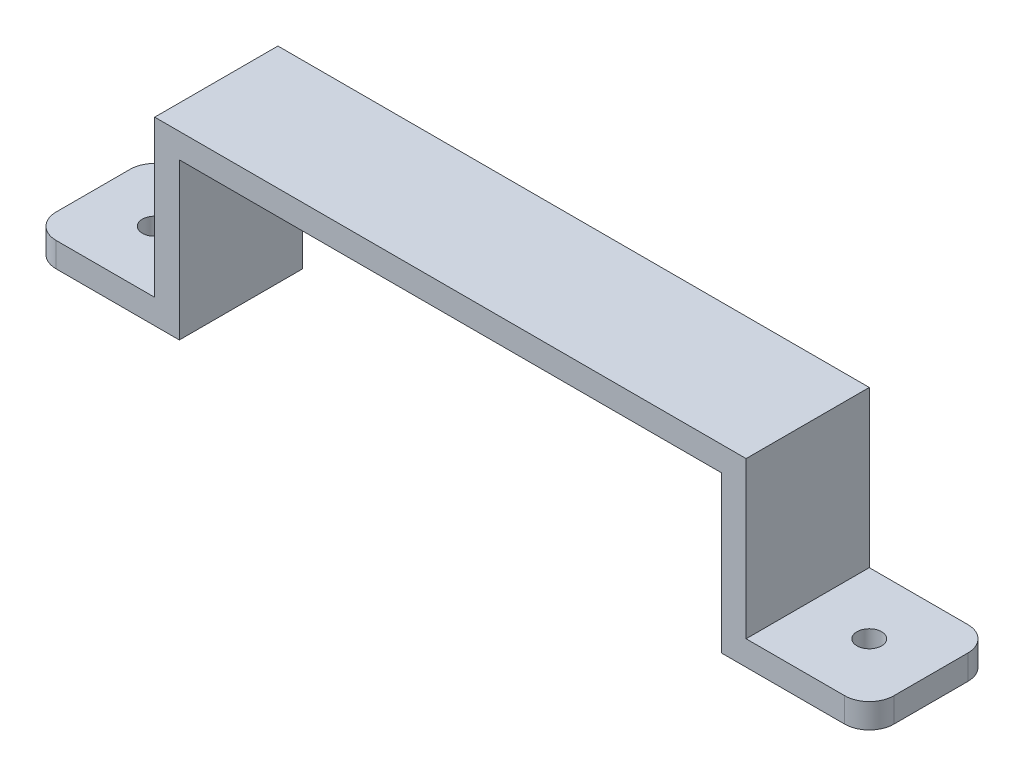
ISO-10303-21;
HEADER;
FILE_DESCRIPTION(('STEP AP214'),'2;1');
FILE_NAME('part.step','',(''),(''),'','','');
FILE_SCHEMA(('AUTOMOTIVE_DESIGN { 1 0 10303 214 1 1 1 1 }'));
ENDSEC;
DATA;
#1=APPLICATION_CONTEXT('core data for automotive mechanical design processes');
#2=APPLICATION_PROTOCOL_DEFINITION('international standard','automotive_design',2000,#1);
#3=PRODUCT_CONTEXT('',#1,'mechanical');
#4=PRODUCT('Part','Part','',(#3));
#5=PRODUCT_RELATED_PRODUCT_CATEGORY('part','',(#4));
#6=PRODUCT_DEFINITION_FORMATION('','',#4);
#7=PRODUCT_DEFINITION_CONTEXT('part definition',#1,'design');
#8=PRODUCT_DEFINITION('design','',#6,#7);
#9=PRODUCT_DEFINITION_SHAPE('','',#8);
#10=(LENGTH_UNIT() NAMED_UNIT(*) SI_UNIT(.MILLI.,.METRE.));
#11=(NAMED_UNIT(*) PLANE_ANGLE_UNIT() SI_UNIT($,.RADIAN.));
#12=(NAMED_UNIT(*) SI_UNIT($,.STERADIAN.) SOLID_ANGLE_UNIT());
#13=UNCERTAINTY_MEASURE_WITH_UNIT(LENGTH_MEASURE(1.E-05),#10,'distance_accuracy_value','');
#14=(GEOMETRIC_REPRESENTATION_CONTEXT(3) GLOBAL_UNCERTAINTY_ASSIGNED_CONTEXT((#13)) GLOBAL_UNIT_ASSIGNED_CONTEXT((#10,
#11,#12)) REPRESENTATION_CONTEXT('',''));
#15=CARTESIAN_POINT('',(0.,0.,0.));
#16=DIRECTION('',(0.,0.,1.));
#17=DIRECTION('',(1.,0.,0.));
#18=AXIS2_PLACEMENT_3D('',#15,#16,#17);
#19=CARTESIAN_POINT('',(-36.,-19.,15.));
#20=DIRECTION('',(1.,0.,0.));
#21=DIRECTION('',(0.,0.,-1.));
#22=AXIS2_PLACEMENT_3D('',#19,#20,#21);
#23=PLANE('',#22);
#24=DIRECTION('',(0.,-1.,0.));
#25=VECTOR('',#24,1.);
#26=CARTESIAN_POINT('',(-36.,-19.,0.));
#27=LINE('',#26,#25);
#28=CARTESIAN_POINT('',(-36.,0.,0.));
#29=VERTEX_POINT('',#28);
#30=CARTESIAN_POINT('',(-36.,-19.,0.));
#31=VERTEX_POINT('',#30);
#32=EDGE_CURVE('E184',#29,#31,#27,.T.);
#33=ORIENTED_EDGE('',*,*,#32,.T.);
#34=DIRECTION('',(0.,0.,-1.));
#35=VECTOR('',#34,1.);
#36=CARTESIAN_POINT('',(-36.,-19.,15.));
#37=LINE('',#36,#35);
#38=CARTESIAN_POINT('',(-36.,-19.,15.));
#39=VERTEX_POINT('',#38);
#40=EDGE_CURVE('E162',#39,#31,#37,.T.);
#41=ORIENTED_EDGE('',*,*,#40,.F.);
#42=DIRECTION('',(0.,-1.,0.));
#43=VECTOR('',#42,1.);
#44=CARTESIAN_POINT('',(-36.,-19.,15.));
#45=LINE('',#44,#43);
#46=CARTESIAN_POINT('',(-36.,0.,15.));
#47=VERTEX_POINT('',#46);
#48=EDGE_CURVE('E171',#47,#39,#45,.T.);
#49=ORIENTED_EDGE('',*,*,#48,.F.);
#50=DIRECTION('',(0.,0.,-1.));
#51=VECTOR('',#50,1.);
#52=CARTESIAN_POINT('',(-36.,0.,15.));
#53=LINE('',#52,#51);
#54=EDGE_CURVE('E317',#47,#29,#53,.T.);
#55=ORIENTED_EDGE('',*,*,#54,.T.);
#56=EDGE_LOOP('',(#33,#41,#49,#55));
#57=FACE_BOUND('',#56,.T.);
#58=ADVANCED_FACE('F42',(#57),#23,.F.);
#59=CARTESIAN_POINT('',(-51.,-19.,15.));
#60=DIRECTION('',(0.,-1.,0.));
#61=DIRECTION('',(1.,0.,0.));
#62=AXIS2_PLACEMENT_3D('',#59,#60,#61);
#63=PLANE('',#62);
#64=CARTESIAN_POINT('',(-43.5,-19.,7.5));
#65=DIRECTION('',(0.,1.,0.));
#66=DIRECTION('',(0.,0.,1.));
#67=AXIS2_PLACEMENT_3D('',#64,#65,#66);
#68=CIRCLE('',#67,1.5);
#69=CARTESIAN_POINT('',(-43.5,-19.,9.00000000000001));
#70=VERTEX_POINT('',#69);
#71=EDGE_CURVE('E427',#70,#70,#68,.T.);
#72=ORIENTED_EDGE('',*,*,#71,.F.);
#73=EDGE_LOOP('',(#72));
#74=FACE_BOUND('',#73,.T.);
#75=DIRECTION('',(0.,0.,-1.));
#76=VECTOR('',#75,1.);
#77=CARTESIAN_POINT('',(-51.,-19.,15.));
#78=LINE('',#77,#76);
#79=CARTESIAN_POINT('',(-51.,-19.,12.));
#80=VERTEX_POINT('',#79);
#81=CARTESIAN_POINT('',(-51.,-19.,3.));
#82=VERTEX_POINT('',#81);
#83=EDGE_CURVE('E187',#80,#82,#78,.T.);
#84=ORIENTED_EDGE('',*,*,#83,.F.);
#85=CARTESIAN_POINT('',(-48.,-19.,12.));
#86=DIRECTION('',(0.,-1.,0.));
#87=DIRECTION('',(1.,0.,0.));
#88=AXIS2_PLACEMENT_3D('',#85,#86,#87);
#89=CIRCLE('',#88,3.);
#90=CARTESIAN_POINT('',(-48.,-19.,15.));
#91=VERTEX_POINT('',#90);
#92=EDGE_CURVE('E165',#80,#91,#89,.F.);
#93=ORIENTED_EDGE('',*,*,#92,.T.);
#94=DIRECTION('',(-1.,0.,0.));
#95=VECTOR('',#94,1.);
#96=CARTESIAN_POINT('',(-51.,-19.,15.));
#97=LINE('',#96,#95);
#98=EDGE_CURVE('E156',#39,#91,#97,.T.);
#99=ORIENTED_EDGE('',*,*,#98,.F.);
#100=ORIENTED_EDGE('',*,*,#40,.T.);
#101=DIRECTION('',(-1.,0.,0.));
#102=VECTOR('',#101,1.);
#103=CARTESIAN_POINT('',(-51.,-19.,0.));
#104=LINE('',#103,#102);
#105=CARTESIAN_POINT('',(-48.,-19.,0.));
#106=VERTEX_POINT('',#105);
#107=EDGE_CURVE('E320',#31,#106,#104,.T.);
#108=ORIENTED_EDGE('',*,*,#107,.T.);
#109=CARTESIAN_POINT('',(-48.,-19.,3.));
#110=DIRECTION('',(0.,-1.,0.));
#111=DIRECTION('',(1.,0.,0.));
#112=AXIS2_PLACEMENT_3D('',#109,#110,#111);
#113=CIRCLE('',#112,3.);
#114=EDGE_CURVE('E219',#106,#82,#113,.F.);
#115=ORIENTED_EDGE('',*,*,#114,.T.);
#116=EDGE_LOOP('',(#84,#93,#99,#100,#108,#115));
#117=FACE_BOUND('',#116,.T.);
#118=ADVANCED_FACE('F159',(#74,#117),#63,.F.);
#119=CARTESIAN_POINT('',(-51.,-22.,15.));
#120=DIRECTION('',(1.,0.,0.));
#121=DIRECTION('',(0.,0.,-1.));
#122=AXIS2_PLACEMENT_3D('',#119,#120,#121);
#123=PLANE('',#122);
#124=DIRECTION('',(0.,0.,-1.));
#125=VECTOR('',#124,1.);
#126=CARTESIAN_POINT('',(-51.,-22.,15.));
#127=LINE('',#126,#125);
#128=CARTESIAN_POINT('',(-51.,-22.,12.));
#129=VERTEX_POINT('',#128);
#130=CARTESIAN_POINT('',(-51.,-22.,3.));
#131=VERTEX_POINT('',#130);
#132=EDGE_CURVE('E195',#129,#131,#127,.T.);
#133=ORIENTED_EDGE('',*,*,#132,.F.);
#134=DIRECTION('',(0.,-1.,0.));
#135=VECTOR('',#134,1.);
#136=CARTESIAN_POINT('',(-51.,-22.,12.));
#137=LINE('',#136,#135);
#138=EDGE_CURVE('E216',#129,#80,#137,.F.);
#139=ORIENTED_EDGE('',*,*,#138,.T.);
#140=ORIENTED_EDGE('',*,*,#83,.T.);
#141=DIRECTION('',(0.,-1.,0.));
#142=VECTOR('',#141,1.);
#143=CARTESIAN_POINT('',(-51.,-22.,3.));
#144=LINE('',#143,#142);
#145=EDGE_CURVE('E212',#82,#131,#144,.T.);
#146=ORIENTED_EDGE('',*,*,#145,.T.);
#147=EDGE_LOOP('',(#133,#139,#140,#146));
#148=FACE_BOUND('',#147,.T.);
#149=ADVANCED_FACE('F287',(#148),#123,.F.);
#150=CARTESIAN_POINT('',(-33.,-22.,15.));
#151=DIRECTION('',(0.,1.,0.));
#152=DIRECTION('',(-1.,0.,0.));
#153=AXIS2_PLACEMENT_3D('',#150,#151,#152);
#154=PLANE('',#153);
#155=CARTESIAN_POINT('',(-43.5,-22.,7.5));
#156=DIRECTION('',(0.,1.,0.));
#157=DIRECTION('',(-1.,0.,0.));
#158=AXIS2_PLACEMENT_3D('',#155,#156,#157);
#159=CIRCLE('',#158,1.5);
#160=CARTESIAN_POINT('',(-45.,-22.,7.5));
#161=VERTEX_POINT('',#160);
#162=EDGE_CURVE('E199',#161,#161,#159,.T.);
#163=ORIENTED_EDGE('',*,*,#162,.T.);
#164=EDGE_LOOP('',(#163));
#165=FACE_BOUND('',#164,.T.);
#166=DIRECTION('',(1.,0.,0.));
#167=VECTOR('',#166,1.);
#168=CARTESIAN_POINT('',(-33.,-22.,15.));
#169=LINE('',#168,#167);
#170=CARTESIAN_POINT('',(-48.,-22.,15.));
#171=VERTEX_POINT('',#170);
#172=CARTESIAN_POINT('',(-33.,-22.,15.));
#173=VERTEX_POINT('',#172);
#174=EDGE_CURVE('E170',#171,#173,#169,.T.);
#175=ORIENTED_EDGE('',*,*,#174,.F.);
#176=CARTESIAN_POINT('',(-48.,-22.,12.));
#177=DIRECTION('',(0.,1.,0.));
#178=DIRECTION('',(-1.,0.,0.));
#179=AXIS2_PLACEMENT_3D('',#176,#177,#178);
#180=CIRCLE('',#179,3.);
#181=EDGE_CURVE('E209',#171,#129,#180,.F.);
#182=ORIENTED_EDGE('',*,*,#181,.T.);
#183=ORIENTED_EDGE('',*,*,#132,.T.);
#184=CARTESIAN_POINT('',(-48.,-22.,3.));
#185=DIRECTION('',(0.,1.,0.));
#186=DIRECTION('',(-1.,0.,0.));
#187=AXIS2_PLACEMENT_3D('',#184,#185,#186);
#188=CIRCLE('',#187,3.);
#189=CARTESIAN_POINT('',(-48.,-22.,0.));
#190=VERTEX_POINT('',#189);
#191=EDGE_CURVE('E206',#131,#190,#188,.F.);
#192=ORIENTED_EDGE('',*,*,#191,.T.);
#193=DIRECTION('',(1.,0.,0.));
#194=VECTOR('',#193,1.);
#195=CARTESIAN_POINT('',(-33.,-22.,0.));
#196=LINE('',#195,#194);
#197=CARTESIAN_POINT('',(-33.,-22.,0.));
#198=VERTEX_POINT('',#197);
#199=EDGE_CURVE('E323',#190,#198,#196,.T.);
#200=ORIENTED_EDGE('',*,*,#199,.T.);
#201=DIRECTION('',(0.,0.,-1.));
#202=VECTOR('',#201,1.);
#203=CARTESIAN_POINT('',(-33.,-22.,15.));
#204=LINE('',#203,#202);
#205=EDGE_CURVE('E275',#173,#198,#204,.T.);
#206=ORIENTED_EDGE('',*,*,#205,.F.);
#207=EDGE_LOOP('',(#175,#182,#183,#192,#200,#206));
#208=FACE_BOUND('',#207,.T.);
#209=ADVANCED_FACE('F283',(#165,#208),#154,.F.);
#210=CARTESIAN_POINT('',(-33.,-3.00000000000001,15.));
#211=DIRECTION('',(-1.,0.,0.));
#212=DIRECTION('',(0.,-1.,0.));
#213=AXIS2_PLACEMENT_3D('',#210,#211,#212);
#214=PLANE('',#213);
#215=DIRECTION('',(0.,1.,0.));
#216=VECTOR('',#215,1.);
#217=CARTESIAN_POINT('',(-33.,-3.00000000000001,0.));
#218=LINE('',#217,#216);
#219=CARTESIAN_POINT('',(-33.,-3.00000000000001,0.));
#220=VERTEX_POINT('',#219);
#221=EDGE_CURVE('E326',#198,#220,#218,.T.);
#222=ORIENTED_EDGE('',*,*,#221,.T.);
#223=DIRECTION('',(0.,0.,-1.));
#224=VECTOR('',#223,1.);
#225=CARTESIAN_POINT('',(-33.,-3.00000000000001,15.));
#226=LINE('',#225,#224);
#227=CARTESIAN_POINT('',(-33.,-3.00000000000001,15.));
#228=VERTEX_POINT('',#227);
#229=EDGE_CURVE('E271',#228,#220,#226,.T.);
#230=ORIENTED_EDGE('',*,*,#229,.F.);
#231=DIRECTION('',(0.,1.,0.));
#232=VECTOR('',#231,1.);
#233=CARTESIAN_POINT('',(-33.,-3.00000000000001,15.));
#234=LINE('',#233,#232);
#235=EDGE_CURVE('E294',#173,#228,#234,.T.);
#236=ORIENTED_EDGE('',*,*,#235,.F.);
#237=ORIENTED_EDGE('',*,*,#205,.T.);
#238=EDGE_LOOP('',(#222,#230,#236,#237));
#239=FACE_BOUND('',#238,.T.);
#240=ADVANCED_FACE('F385',(#239),#214,.F.);
#241=CARTESIAN_POINT('',(33.,-3.,15.));
#242=DIRECTION('',(0.,1.,0.));
#243=DIRECTION('',(-1.,0.,0.));
#244=AXIS2_PLACEMENT_3D('',#241,#242,#243);
#245=PLANE('',#244);
#246=DIRECTION('',(1.,0.,0.));
#247=VECTOR('',#246,1.);
#248=CARTESIAN_POINT('',(33.,-3.,0.));
#249=LINE('',#248,#247);
#250=CARTESIAN_POINT('',(33.,-3.,0.));
#251=VERTEX_POINT('',#250);
#252=EDGE_CURVE('E329',#220,#251,#249,.T.);
#253=ORIENTED_EDGE('',*,*,#252,.T.);
#254=DIRECTION('',(0.,0.,-1.));
#255=VECTOR('',#254,1.);
#256=CARTESIAN_POINT('',(33.,-3.,15.));
#257=LINE('',#256,#255);
#258=CARTESIAN_POINT('',(33.,-3.,15.));
#259=VERTEX_POINT('',#258);
#260=EDGE_CURVE('E267',#259,#251,#257,.T.);
#261=ORIENTED_EDGE('',*,*,#260,.F.);
#262=DIRECTION('',(1.,0.,0.));
#263=VECTOR('',#262,1.);
#264=CARTESIAN_POINT('',(33.,-3.,15.));
#265=LINE('',#264,#263);
#266=EDGE_CURVE('E297',#228,#259,#265,.T.);
#267=ORIENTED_EDGE('',*,*,#266,.F.);
#268=ORIENTED_EDGE('',*,*,#229,.T.);
#269=EDGE_LOOP('',(#253,#261,#267,#268));
#270=FACE_BOUND('',#269,.T.);
#271=ADVANCED_FACE('F389',(#270),#245,.F.);
#272=CARTESIAN_POINT('',(33.,-22.,15.));
#273=DIRECTION('',(1.,0.,0.));
#274=DIRECTION('',(0.,1.,0.));
#275=AXIS2_PLACEMENT_3D('',#272,#273,#274);
#276=PLANE('',#275);
#277=DIRECTION('',(0.,-1.,0.));
#278=VECTOR('',#277,1.);
#279=CARTESIAN_POINT('',(33.,-22.,0.));
#280=LINE('',#279,#278);
#281=CARTESIAN_POINT('',(33.,-22.,0.));
#282=VERTEX_POINT('',#281);
#283=EDGE_CURVE('E332',#251,#282,#280,.T.);
#284=ORIENTED_EDGE('',*,*,#283,.T.);
#285=DIRECTION('',(0.,0.,-1.));
#286=VECTOR('',#285,1.);
#287=CARTESIAN_POINT('',(33.,-22.,15.));
#288=LINE('',#287,#286);
#289=CARTESIAN_POINT('',(33.,-22.,15.));
#290=VERTEX_POINT('',#289);
#291=EDGE_CURVE('E257',#290,#282,#288,.T.);
#292=ORIENTED_EDGE('',*,*,#291,.F.);
#293=DIRECTION('',(0.,-1.,0.));
#294=VECTOR('',#293,1.);
#295=CARTESIAN_POINT('',(33.,-22.,15.));
#296=LINE('',#295,#294);
#297=EDGE_CURVE('E302',#259,#290,#296,.T.);
#298=ORIENTED_EDGE('',*,*,#297,.F.);
#299=ORIENTED_EDGE('',*,*,#260,.T.);
#300=EDGE_LOOP('',(#284,#292,#298,#299));
#301=FACE_BOUND('',#300,.T.);
#302=ADVANCED_FACE('F393',(#301),#276,.F.);
#303=CARTESIAN_POINT('',(51.,-22.,15.));
#304=DIRECTION('',(0.,1.,0.));
#305=DIRECTION('',(-1.,0.,0.));
#306=AXIS2_PLACEMENT_3D('',#303,#304,#305);
#307=PLANE('',#306);
#308=CARTESIAN_POINT('',(43.5,-22.,7.5));
#309=DIRECTION('',(0.,1.,0.));
#310=DIRECTION('',(-1.,0.,0.));
#311=AXIS2_PLACEMENT_3D('',#308,#309,#310);
#312=CIRCLE('',#311,1.5);
#313=CARTESIAN_POINT('',(42.,-22.,7.5));
#314=VERTEX_POINT('',#313);
#315=EDGE_CURVE('E202',#314,#314,#312,.T.);
#316=ORIENTED_EDGE('',*,*,#315,.T.);
#317=EDGE_LOOP('',(#316));
#318=FACE_BOUND('',#317,.T.);
#319=DIRECTION('',(0.,0.,-1.));
#320=VECTOR('',#319,1.);
#321=CARTESIAN_POINT('',(51.,-22.,15.));
#322=LINE('',#321,#320);
#323=CARTESIAN_POINT('',(51.,-22.,12.));
#324=VERTEX_POINT('',#323);
#325=CARTESIAN_POINT('',(51.,-22.,3.));
#326=VERTEX_POINT('',#325);
#327=EDGE_CURVE('E246',#324,#326,#322,.T.);
#328=ORIENTED_EDGE('',*,*,#327,.F.);
#329=CARTESIAN_POINT('',(48.,-22.,12.));
#330=DIRECTION('',(0.,1.,0.));
#331=DIRECTION('',(-1.,0.,0.));
#332=AXIS2_PLACEMENT_3D('',#329,#330,#331);
#333=CIRCLE('',#332,3.);
#334=CARTESIAN_POINT('',(48.,-22.,15.));
#335=VERTEX_POINT('',#334);
#336=EDGE_CURVE('E11',#324,#335,#333,.F.);
#337=ORIENTED_EDGE('',*,*,#336,.T.);
#338=DIRECTION('',(1.,0.,0.));
#339=VECTOR('',#338,1.);
#340=CARTESIAN_POINT('',(51.,-22.,15.));
#341=LINE('',#340,#339);
#342=EDGE_CURVE('E305',#290,#335,#341,.T.);
#343=ORIENTED_EDGE('',*,*,#342,.F.);
#344=ORIENTED_EDGE('',*,*,#291,.T.);
#345=DIRECTION('',(1.,0.,0.));
#346=VECTOR('',#345,1.);
#347=CARTESIAN_POINT('',(51.,-22.,0.));
#348=LINE('',#347,#346);
#349=CARTESIAN_POINT('',(48.,-22.,0.));
#350=VERTEX_POINT('',#349);
#351=EDGE_CURVE('E335',#282,#350,#348,.T.);
#352=ORIENTED_EDGE('',*,*,#351,.T.);
#353=CARTESIAN_POINT('',(48.,-22.,3.));
#354=DIRECTION('',(0.,1.,0.));
#355=DIRECTION('',(-1.,0.,0.));
#356=AXIS2_PLACEMENT_3D('',#353,#354,#355);
#357=CIRCLE('',#356,3.);
#358=EDGE_CURVE('E51',#350,#326,#357,.F.);
#359=ORIENTED_EDGE('',*,*,#358,.T.);
#360=EDGE_LOOP('',(#328,#337,#343,#344,#352,#359));
#361=FACE_BOUND('',#360,.T.);
#362=ADVANCED_FACE('F397',(#318,#361),#307,.F.);
#363=CARTESIAN_POINT('',(51.,-19.,15.));
#364=DIRECTION('',(-1.,0.,0.));
#365=DIRECTION('',(0.,0.,1.));
#366=AXIS2_PLACEMENT_3D('',#363,#364,#365);
#367=PLANE('',#366);
#368=DIRECTION('',(0.,0.,-1.));
#369=VECTOR('',#368,1.);
#370=CARTESIAN_POINT('',(51.,-19.,15.));
#371=LINE('',#370,#369);
#372=CARTESIAN_POINT('',(51.,-19.,12.));
#373=VERTEX_POINT('',#372);
#374=CARTESIAN_POINT('',(51.,-19.,3.));
#375=VERTEX_POINT('',#374);
#376=EDGE_CURVE('E245',#373,#375,#371,.T.);
#377=ORIENTED_EDGE('',*,*,#376,.F.);
#378=DIRECTION('',(0.,1.,0.));
#379=VECTOR('',#378,1.);
#380=CARTESIAN_POINT('',(51.,-19.,12.));
#381=LINE('',#380,#379);
#382=EDGE_CURVE('E64',#373,#324,#381,.F.);
#383=ORIENTED_EDGE('',*,*,#382,.T.);
#384=ORIENTED_EDGE('',*,*,#327,.T.);
#385=DIRECTION('',(0.,1.,0.));
#386=VECTOR('',#385,1.);
#387=CARTESIAN_POINT('',(51.,-19.,3.));
#388=LINE('',#387,#386);
#389=EDGE_CURVE('E236',#326,#375,#388,.T.);
#390=ORIENTED_EDGE('',*,*,#389,.T.);
#391=EDGE_LOOP('',(#377,#383,#384,#390));
#392=FACE_BOUND('',#391,.T.);
#393=ADVANCED_FACE('F244',(#392),#367,.F.);
#394=CARTESIAN_POINT('',(36.,-19.,15.));
#395=DIRECTION('',(0.,-1.,0.));
#396=DIRECTION('',(1.,0.,0.));
#397=AXIS2_PLACEMENT_3D('',#394,#395,#396);
#398=PLANE('',#397);
#399=CARTESIAN_POINT('',(43.5,-19.,7.5));
#400=DIRECTION('',(0.,1.,0.));
#401=DIRECTION('',(0.,0.,1.));
#402=AXIS2_PLACEMENT_3D('',#399,#400,#401);
#403=CIRCLE('',#402,1.5);
#404=CARTESIAN_POINT('',(43.5,-19.,9.00000000000001));
#405=VERTEX_POINT('',#404);
#406=EDGE_CURVE('E430',#405,#405,#403,.T.);
#407=ORIENTED_EDGE('',*,*,#406,.F.);
#408=EDGE_LOOP('',(#407));
#409=FACE_BOUND('',#408,.T.);
#410=DIRECTION('',(-1.,0.,0.));
#411=VECTOR('',#410,1.);
#412=CARTESIAN_POINT('',(36.,-19.,15.));
#413=LINE('',#412,#411);
#414=CARTESIAN_POINT('',(48.,-19.,15.));
#415=VERTEX_POINT('',#414);
#416=CARTESIAN_POINT('',(36.,-19.,15.));
#417=VERTEX_POINT('',#416);
#418=EDGE_CURVE('E309',#415,#417,#413,.T.);
#419=ORIENTED_EDGE('',*,*,#418,.F.);
#420=CARTESIAN_POINT('',(48.,-19.,12.));
#421=DIRECTION('',(0.,-1.,0.));
#422=DIRECTION('',(1.,0.,0.));
#423=AXIS2_PLACEMENT_3D('',#420,#421,#422);
#424=CIRCLE('',#423,3.);
#425=EDGE_CURVE('E233',#415,#373,#424,.F.);
#426=ORIENTED_EDGE('',*,*,#425,.T.);
#427=ORIENTED_EDGE('',*,*,#376,.T.);
#428=CARTESIAN_POINT('',(48.,-19.,3.));
#429=DIRECTION('',(0.,-1.,0.));
#430=DIRECTION('',(1.,0.,0.));
#431=AXIS2_PLACEMENT_3D('',#428,#429,#430);
#432=CIRCLE('',#431,3.);
#433=CARTESIAN_POINT('',(48.,-19.,0.));
#434=VERTEX_POINT('',#433);
#435=EDGE_CURVE('E230',#375,#434,#432,.F.);
#436=ORIENTED_EDGE('',*,*,#435,.T.);
#437=DIRECTION('',(-1.,0.,0.));
#438=VECTOR('',#437,1.);
#439=CARTESIAN_POINT('',(36.,-19.,0.));
#440=LINE('',#439,#438);
#441=CARTESIAN_POINT('',(36.,-19.,0.));
#442=VERTEX_POINT('',#441);
#443=EDGE_CURVE('E338',#434,#442,#440,.T.);
#444=ORIENTED_EDGE('',*,*,#443,.T.);
#445=DIRECTION('',(0.,0.,-1.));
#446=VECTOR('',#445,1.);
#447=CARTESIAN_POINT('',(36.,-19.,15.));
#448=LINE('',#447,#446);
#449=EDGE_CURVE('E253',#417,#442,#448,.T.);
#450=ORIENTED_EDGE('',*,*,#449,.F.);
#451=EDGE_LOOP('',(#419,#426,#427,#436,#444,#450));
#452=FACE_BOUND('',#451,.T.);
#453=ADVANCED_FACE('F250',(#409,#452),#398,.F.);
#454=CARTESIAN_POINT('',(36.,0.,15.));
#455=DIRECTION('',(-1.,0.,0.));
#456=DIRECTION('',(0.,0.,1.));
#457=AXIS2_PLACEMENT_3D('',#454,#455,#456);
#458=PLANE('',#457);
#459=DIRECTION('',(0.,1.,0.));
#460=VECTOR('',#459,1.);
#461=CARTESIAN_POINT('',(36.,0.,0.));
#462=LINE('',#461,#460);
#463=CARTESIAN_POINT('',(36.,0.,0.));
#464=VERTEX_POINT('',#463);
#465=EDGE_CURVE('E341',#442,#464,#462,.T.);
#466=ORIENTED_EDGE('',*,*,#465,.T.);
#467=DIRECTION('',(0.,0.,-1.));
#468=VECTOR('',#467,1.);
#469=CARTESIAN_POINT('',(36.,0.,15.));
#470=LINE('',#469,#468);
#471=CARTESIAN_POINT('',(36.,0.,15.));
#472=VERTEX_POINT('',#471);
#473=EDGE_CURVE('E260',#472,#464,#470,.T.);
#474=ORIENTED_EDGE('',*,*,#473,.F.);
#475=DIRECTION('',(0.,1.,0.));
#476=VECTOR('',#475,1.);
#477=CARTESIAN_POINT('',(36.,0.,15.));
#478=LINE('',#477,#476);
#479=EDGE_CURVE('E312',#417,#472,#478,.T.);
#480=ORIENTED_EDGE('',*,*,#479,.F.);
#481=ORIENTED_EDGE('',*,*,#449,.T.);
#482=EDGE_LOOP('',(#466,#474,#480,#481));
#483=FACE_BOUND('',#482,.T.);
#484=ADVANCED_FACE('F406',(#483),#458,.F.);
#485=CARTESIAN_POINT('',(-36.,0.,15.));
#486=DIRECTION('',(0.,-1.,0.));
#487=DIRECTION('',(1.,0.,0.));
#488=AXIS2_PLACEMENT_3D('',#485,#486,#487);
#489=PLANE('',#488);
#490=DIRECTION('',(-1.,0.,0.));
#491=VECTOR('',#490,1.);
#492=CARTESIAN_POINT('',(-36.,0.,0.));
#493=LINE('',#492,#491);
#494=EDGE_CURVE('E181',#464,#29,#493,.T.);
#495=ORIENTED_EDGE('',*,*,#494,.T.);
#496=ORIENTED_EDGE('',*,*,#54,.F.);
#497=DIRECTION('',(-1.,0.,0.));
#498=VECTOR('',#497,1.);
#499=CARTESIAN_POINT('',(-36.,0.,15.));
#500=LINE('',#499,#498);
#501=EDGE_CURVE('E176',#472,#47,#500,.T.);
#502=ORIENTED_EDGE('',*,*,#501,.F.);
#503=ORIENTED_EDGE('',*,*,#473,.T.);
#504=EDGE_LOOP('',(#495,#496,#502,#503));
#505=FACE_BOUND('',#504,.T.);
#506=ADVANCED_FACE('F352',(#505),#489,.F.);
#507=CARTESIAN_POINT('',(0.,0.,15.));
#508=DIRECTION('',(0.,0.,-1.));
#509=DIRECTION('',(-1.,0.,0.));
#510=AXIS2_PLACEMENT_3D('',#507,#508,#509);
#511=PLANE('',#510);
#512=ORIENTED_EDGE('',*,*,#98,.T.);
#513=DIRECTION('',(0.,-1.,0.));
#514=VECTOR('',#513,1.);
#515=CARTESIAN_POINT('',(-48.,0.,15.));
#516=LINE('',#515,#514);
#517=EDGE_CURVE('E192',#91,#171,#516,.T.);
#518=ORIENTED_EDGE('',*,*,#517,.T.);
#519=ORIENTED_EDGE('',*,*,#174,.T.);
#520=ORIENTED_EDGE('',*,*,#235,.T.);
#521=ORIENTED_EDGE('',*,*,#266,.T.);
#522=ORIENTED_EDGE('',*,*,#297,.T.);
#523=ORIENTED_EDGE('',*,*,#342,.T.);
#524=DIRECTION('',(0.,1.,0.));
#525=VECTOR('',#524,1.);
#526=CARTESIAN_POINT('',(48.,0.,15.));
#527=LINE('',#526,#525);
#528=EDGE_CURVE('E186',#335,#415,#527,.T.);
#529=ORIENTED_EDGE('',*,*,#528,.T.);
#530=ORIENTED_EDGE('',*,*,#418,.T.);
#531=ORIENTED_EDGE('',*,*,#479,.T.);
#532=ORIENTED_EDGE('',*,*,#501,.T.);
#533=ORIENTED_EDGE('',*,*,#48,.T.);
#534=EDGE_LOOP('',(#512,#518,#519,#520,#521,#522,#523,#529,#530,#531,#532,#533));
#535=FACE_BOUND('',#534,.T.);
#536=ADVANCED_FACE('F174',(#535),#511,.F.);
#537=CARTESIAN_POINT('',(0.,0.,0.));
#538=DIRECTION('',(0.,0.,-1.));
#539=DIRECTION('',(-1.,0.,0.));
#540=AXIS2_PLACEMENT_3D('',#537,#538,#539);
#541=PLANE('',#540);
#542=ORIENTED_EDGE('',*,*,#199,.F.);
#543=DIRECTION('',(0.,-1.,0.));
#544=VECTOR('',#543,1.);
#545=CARTESIAN_POINT('',(-48.,-19.,0.));
#546=LINE('',#545,#544);
#547=EDGE_CURVE('E227',#190,#106,#546,.F.);
#548=ORIENTED_EDGE('',*,*,#547,.T.);
#549=ORIENTED_EDGE('',*,*,#107,.F.);
#550=ORIENTED_EDGE('',*,*,#32,.F.);
#551=ORIENTED_EDGE('',*,*,#494,.F.);
#552=ORIENTED_EDGE('',*,*,#465,.F.);
#553=ORIENTED_EDGE('',*,*,#443,.F.);
#554=DIRECTION('',(0.,1.,0.));
#555=VECTOR('',#554,1.);
#556=CARTESIAN_POINT('',(48.,-22.,0.));
#557=LINE('',#556,#555);
#558=EDGE_CURVE('E224',#434,#350,#557,.F.);
#559=ORIENTED_EDGE('',*,*,#558,.T.);
#560=ORIENTED_EDGE('',*,*,#351,.F.);
#561=ORIENTED_EDGE('',*,*,#283,.F.);
#562=ORIENTED_EDGE('',*,*,#252,.F.);
#563=ORIENTED_EDGE('',*,*,#221,.F.);
#564=EDGE_LOOP('',(#542,#548,#549,#550,#551,#552,#553,#559,#560,#561,#562,#563));
#565=FACE_BOUND('',#564,.T.);
#566=ADVANCED_FACE('F357',(#565),#541,.T.);
#567=CARTESIAN_POINT('',(43.5,-39.,7.5));
#568=DIRECTION('',(0.,1.,0.));
#569=DIRECTION('',(0.,0.,1.));
#570=AXIS2_PLACEMENT_3D('',#567,#568,#569);
#571=CYLINDRICAL_SURFACE('',#570,1.5);
#572=ORIENTED_EDGE('',*,*,#406,.T.);
#573=EDGE_LOOP('',(#572));
#574=FACE_BOUND('',#573,.T.);
#575=ORIENTED_EDGE('',*,*,#315,.F.);
#576=EDGE_LOOP('',(#575));
#577=FACE_BOUND('',#576,.T.);
#578=ADVANCED_FACE('F414',(#574,#577),#571,.F.);
#579=CARTESIAN_POINT('',(-43.5,-39.,7.5));
#580=DIRECTION('',(0.,1.,0.));
#581=DIRECTION('',(0.,0.,1.));
#582=AXIS2_PLACEMENT_3D('',#579,#580,#581);
#583=CYLINDRICAL_SURFACE('',#582,1.5);
#584=ORIENTED_EDGE('',*,*,#71,.T.);
#585=EDGE_LOOP('',(#584));
#586=FACE_BOUND('',#585,.T.);
#587=ORIENTED_EDGE('',*,*,#162,.F.);
#588=EDGE_LOOP('',(#587));
#589=FACE_BOUND('',#588,.T.);
#590=ADVANCED_FACE('F370',(#586,#589),#583,.F.);
#591=CARTESIAN_POINT('',(-48.,0.,12.));
#592=DIRECTION('',(0.,-1.,0.));
#593=DIRECTION('',(0.,0.,-1.));
#594=AXIS2_PLACEMENT_3D('',#591,#592,#593);
#595=CYLINDRICAL_SURFACE('',#594,3.);
#596=ORIENTED_EDGE('',*,*,#92,.F.);
#597=ORIENTED_EDGE('',*,*,#138,.F.);
#598=ORIENTED_EDGE('',*,*,#181,.F.);
#599=ORIENTED_EDGE('',*,*,#517,.F.);
#600=EDGE_LOOP('',(#596,#597,#598,#599));
#601=FACE_BOUND('',#600,.T.);
#602=ADVANCED_FACE('F290',(#601),#595,.T.);
#603=CARTESIAN_POINT('',(-48.,-22.,3.));
#604=DIRECTION('',(0.,1.,0.));
#605=DIRECTION('',(0.,0.,1.));
#606=AXIS2_PLACEMENT_3D('',#603,#604,#605);
#607=CYLINDRICAL_SURFACE('',#606,3.);
#608=ORIENTED_EDGE('',*,*,#114,.F.);
#609=ORIENTED_EDGE('',*,*,#547,.F.);
#610=ORIENTED_EDGE('',*,*,#191,.F.);
#611=ORIENTED_EDGE('',*,*,#145,.F.);
#612=EDGE_LOOP('',(#608,#609,#610,#611));
#613=FACE_BOUND('',#612,.T.);
#614=ADVANCED_FACE('F361',(#613),#607,.T.);
#615=CARTESIAN_POINT('',(48.,0.,12.));
#616=DIRECTION('',(0.,1.,0.));
#617=DIRECTION('',(0.,0.,1.));
#618=AXIS2_PLACEMENT_3D('',#615,#616,#617);
#619=CYLINDRICAL_SURFACE('',#618,3.);
#620=ORIENTED_EDGE('',*,*,#336,.F.);
#621=ORIENTED_EDGE('',*,*,#382,.F.);
#622=ORIENTED_EDGE('',*,*,#425,.F.);
#623=ORIENTED_EDGE('',*,*,#528,.F.);
#624=EDGE_LOOP('',(#620,#621,#622,#623));
#625=FACE_BOUND('',#624,.T.);
#626=ADVANCED_FACE('F363',(#625),#619,.T.);
#627=CARTESIAN_POINT('',(48.,-19.,3.));
#628=DIRECTION('',(0.,-1.,0.));
#629=DIRECTION('',(0.,0.,-1.));
#630=AXIS2_PLACEMENT_3D('',#627,#628,#629);
#631=CYLINDRICAL_SURFACE('',#630,3.);
#632=ORIENTED_EDGE('',*,*,#358,.F.);
#633=ORIENTED_EDGE('',*,*,#558,.F.);
#634=ORIENTED_EDGE('',*,*,#435,.F.);
#635=ORIENTED_EDGE('',*,*,#389,.F.);
#636=EDGE_LOOP('',(#632,#633,#634,#635));
#637=FACE_BOUND('',#636,.T.);
#638=ADVANCED_FACE('F44',(#637),#631,.T.);
#639=CLOSED_SHELL('',(#58,#118,#149,#209,#240,#271,#302,#362,#393,#453,#484,#506,#536,#566,#578,
#590,#602,#614,#626,#638));
#640=MANIFOLD_SOLID_BREP('B2',#639);
#641=ADVANCED_BREP_SHAPE_REPRESENTATION('',(#18,#640),#14);
#642=SHAPE_DEFINITION_REPRESENTATION(#9,#641);
ENDSEC;
END-ISO-10303-21;
